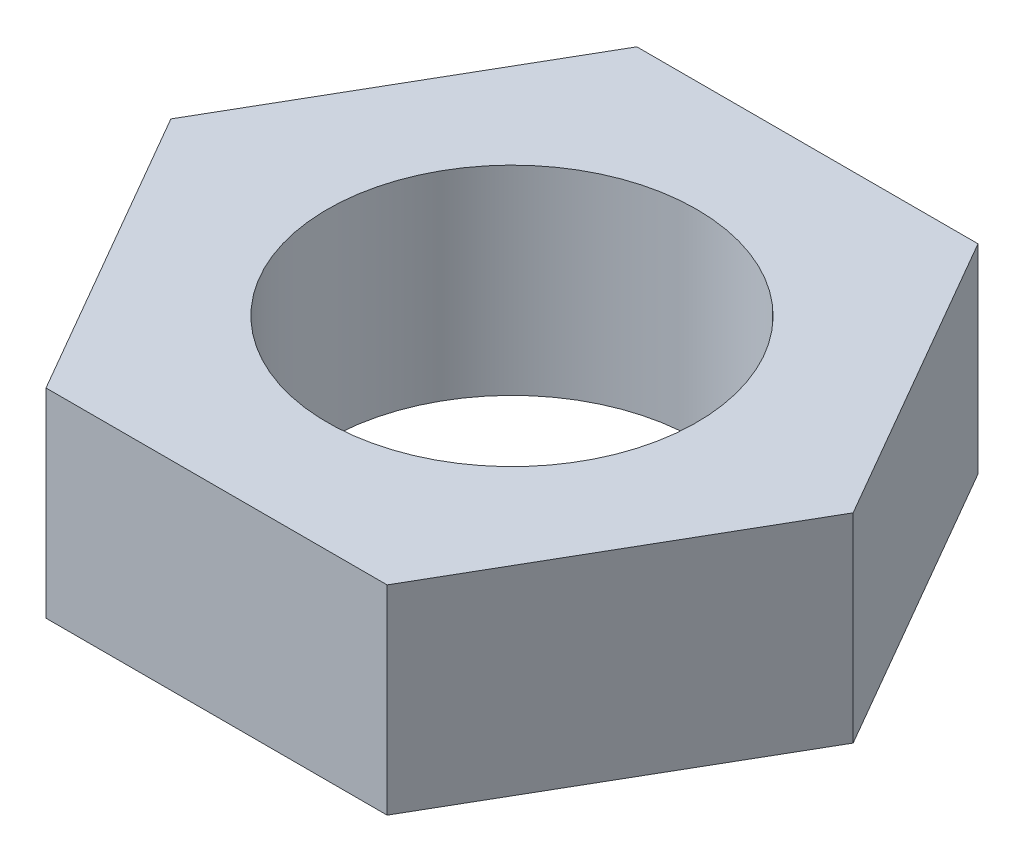
ISO-10303-21;
HEADER;
FILE_DESCRIPTION(('STEP AP214'),'2;1');
FILE_NAME('part.step','',(''),(''),'','','');
FILE_SCHEMA(('AUTOMOTIVE_DESIGN { 1 0 10303 214 1 1 1 1 }'));
ENDSEC;
DATA;
#1=APPLICATION_CONTEXT('core data for automotive mechanical design processes');
#2=APPLICATION_PROTOCOL_DEFINITION('international standard','automotive_design',2000,#1);
#3=PRODUCT_CONTEXT('',#1,'mechanical');
#4=PRODUCT('Part','Part','',(#3));
#5=PRODUCT_RELATED_PRODUCT_CATEGORY('part','',(#4));
#6=PRODUCT_DEFINITION_FORMATION('','',#4);
#7=PRODUCT_DEFINITION_CONTEXT('part definition',#1,'design');
#8=PRODUCT_DEFINITION('design','',#6,#7);
#9=PRODUCT_DEFINITION_SHAPE('','',#8);
#10=(LENGTH_UNIT() NAMED_UNIT(*) SI_UNIT(.MILLI.,.METRE.));
#11=(NAMED_UNIT(*) PLANE_ANGLE_UNIT() SI_UNIT($,.RADIAN.));
#12=(NAMED_UNIT(*) SI_UNIT($,.STERADIAN.) SOLID_ANGLE_UNIT());
#13=UNCERTAINTY_MEASURE_WITH_UNIT(LENGTH_MEASURE(1.E-05),#10,'distance_accuracy_value','');
#14=(GEOMETRIC_REPRESENTATION_CONTEXT(3) GLOBAL_UNCERTAINTY_ASSIGNED_CONTEXT((#13)) GLOBAL_UNIT_ASSIGNED_CONTEXT((#10,
#11,#12)) REPRESENTATION_CONTEXT('',''));
#15=CARTESIAN_POINT('',(0.,0.,0.));
#16=DIRECTION('',(0.,0.,1.));
#17=DIRECTION('',(1.,0.,0.));
#18=AXIS2_PLACEMENT_3D('',#15,#16,#17);
#19=CARTESIAN_POINT('',(0.,1.35,0.));
#20=DIRECTION('',(0.,1.,0.));
#21=DIRECTION('',(0.,0.,1.));
#22=AXIS2_PLACEMENT_3D('',#19,#20,#21);
#23=PLANE('',#22);
#24=DIRECTION('',(-0.5,0.,-0.866025403784439));
#25=VECTOR('',#24,1.);
#26=CARTESIAN_POINT('',(4.61880215351701,1.35,0.));
#27=LINE('',#26,#25);
#28=CARTESIAN_POINT('',(4.61880215351701,1.35,0.));
#29=VERTEX_POINT('',#28);
#30=CARTESIAN_POINT('',(2.3094010767585,1.35,-4.));
#31=VERTEX_POINT('',#30);
#32=EDGE_CURVE('E129',#29,#31,#27,.T.);
#33=ORIENTED_EDGE('',*,*,#32,.T.);
#34=DIRECTION('',(-1.,0.,0.));
#35=VECTOR('',#34,1.);
#36=CARTESIAN_POINT('',(2.3094010767585,1.35,-4.));
#37=LINE('',#36,#35);
#38=CARTESIAN_POINT('',(-2.3094010767585,1.35,-4.));
#39=VERTEX_POINT('',#38);
#40=EDGE_CURVE('E87',#31,#39,#37,.T.);
#41=ORIENTED_EDGE('',*,*,#40,.T.);
#42=DIRECTION('',(-0.499999999999999,0.,0.866025403784439));
#43=VECTOR('',#42,1.);
#44=CARTESIAN_POINT('',(-2.3094010767585,1.35,-4.));
#45=LINE('',#44,#43);
#46=CARTESIAN_POINT('',(-4.618802153517,1.35,0.));
#47=VERTEX_POINT('',#46);
#48=EDGE_CURVE('E100',#39,#47,#45,.T.);
#49=ORIENTED_EDGE('',*,*,#48,.T.);
#50=DIRECTION('',(0.5,0.,0.866025403784438));
#51=VECTOR('',#50,1.);
#52=CARTESIAN_POINT('',(-4.618802153517,1.35,0.));
#53=LINE('',#52,#51);
#54=CARTESIAN_POINT('',(-2.3094010767585,1.35,4.));
#55=VERTEX_POINT('',#54);
#56=EDGE_CURVE('E94',#47,#55,#53,.T.);
#57=ORIENTED_EDGE('',*,*,#56,.T.);
#58=DIRECTION('',(1.,0.,0.));
#59=VECTOR('',#58,1.);
#60=CARTESIAN_POINT('',(-2.3094010767585,1.35,4.));
#61=LINE('',#60,#59);
#62=CARTESIAN_POINT('',(2.3094010767585,1.35,4.));
#63=VERTEX_POINT('',#62);
#64=EDGE_CURVE('E98',#55,#63,#61,.T.);
#65=ORIENTED_EDGE('',*,*,#64,.T.);
#66=DIRECTION('',(0.5,0.,-0.866025403784439));
#67=VECTOR('',#66,1.);
#68=CARTESIAN_POINT('',(2.3094010767585,1.35,4.));
#69=LINE('',#68,#67);
#70=EDGE_CURVE('E50',#63,#29,#69,.T.);
#71=ORIENTED_EDGE('',*,*,#70,.T.);
#72=EDGE_LOOP('',(#33,#41,#49,#57,#65,#71));
#73=FACE_BOUND('',#72,.T.);
#74=CARTESIAN_POINT('',(0.,1.35,0.));
#75=DIRECTION('',(0.,1.,0.));
#76=DIRECTION('',(0.,0.,1.));
#77=AXIS2_PLACEMENT_3D('',#74,#75,#76);
#78=CIRCLE('',#77,2.5);
#79=CARTESIAN_POINT('',(0.,1.35,-2.5));
#80=VERTEX_POINT('',#79);
#81=EDGE_CURVE('E122',#80,#80,#78,.T.);
#82=ORIENTED_EDGE('',*,*,#81,.F.);
#83=EDGE_LOOP('',(#82));
#84=FACE_BOUND('',#83,.T.);
#85=ADVANCED_FACE('F33',(#73,#84),#23,.T.);
#86=CARTESIAN_POINT('',(0.,-1.35,0.));
#87=DIRECTION('',(0.,1.,0.));
#88=DIRECTION('',(0.,0.,1.));
#89=AXIS2_PLACEMENT_3D('',#86,#87,#88);
#90=PLANE('',#89);
#91=DIRECTION('',(-0.5,0.,-0.866025403784439));
#92=VECTOR('',#91,1.);
#93=CARTESIAN_POINT('',(4.61880215351701,-1.35,0.));
#94=LINE('',#93,#92);
#95=CARTESIAN_POINT('',(4.61880215351701,-1.35,0.));
#96=VERTEX_POINT('',#95);
#97=CARTESIAN_POINT('',(2.3094010767585,-1.35,-4.));
#98=VERTEX_POINT('',#97);
#99=EDGE_CURVE('E118',#96,#98,#94,.T.);
#100=ORIENTED_EDGE('',*,*,#99,.F.);
#101=DIRECTION('',(0.5,0.,-0.866025403784439));
#102=VECTOR('',#101,1.);
#103=CARTESIAN_POINT('',(2.3094010767585,-1.35,4.));
#104=LINE('',#103,#102);
#105=CARTESIAN_POINT('',(2.3094010767585,-1.35,4.));
#106=VERTEX_POINT('',#105);
#107=EDGE_CURVE('E79',#106,#96,#104,.T.);
#108=ORIENTED_EDGE('',*,*,#107,.F.);
#109=DIRECTION('',(1.,0.,0.));
#110=VECTOR('',#109,1.);
#111=CARTESIAN_POINT('',(-2.3094010767585,-1.35,4.));
#112=LINE('',#111,#110);
#113=CARTESIAN_POINT('',(-2.3094010767585,-1.35,4.));
#114=VERTEX_POINT('',#113);
#115=EDGE_CURVE('E73',#114,#106,#112,.T.);
#116=ORIENTED_EDGE('',*,*,#115,.F.);
#117=DIRECTION('',(0.5,0.,0.866025403784438));
#118=VECTOR('',#117,1.);
#119=CARTESIAN_POINT('',(-4.618802153517,-1.35,0.));
#120=LINE('',#119,#118);
#121=CARTESIAN_POINT('',(-4.618802153517,-1.35,0.));
#122=VERTEX_POINT('',#121);
#123=EDGE_CURVE('E108',#122,#114,#120,.T.);
#124=ORIENTED_EDGE('',*,*,#123,.F.);
#125=DIRECTION('',(-0.499999999999999,0.,0.866025403784439));
#126=VECTOR('',#125,1.);
#127=CARTESIAN_POINT('',(-2.3094010767585,-1.35,-4.));
#128=LINE('',#127,#126);
#129=CARTESIAN_POINT('',(-2.3094010767585,-1.35,-4.));
#130=VERTEX_POINT('',#129);
#131=EDGE_CURVE('E124',#130,#122,#128,.T.);
#132=ORIENTED_EDGE('',*,*,#131,.F.);
#133=DIRECTION('',(-1.,0.,0.));
#134=VECTOR('',#133,1.);
#135=CARTESIAN_POINT('',(2.3094010767585,-1.35,-4.));
#136=LINE('',#135,#134);
#137=EDGE_CURVE('E121',#98,#130,#136,.T.);
#138=ORIENTED_EDGE('',*,*,#137,.F.);
#139=EDGE_LOOP('',(#100,#108,#116,#124,#132,#138));
#140=FACE_BOUND('',#139,.T.);
#141=CARTESIAN_POINT('',(0.,-1.35,0.));
#142=DIRECTION('',(0.,1.,0.));
#143=DIRECTION('',(0.,0.,1.));
#144=AXIS2_PLACEMENT_3D('',#141,#142,#143);
#145=CIRCLE('',#144,2.5);
#146=CARTESIAN_POINT('',(0.,-1.35,-2.5));
#147=VERTEX_POINT('',#146);
#148=EDGE_CURVE('E222',#147,#147,#145,.T.);
#149=ORIENTED_EDGE('',*,*,#148,.T.);
#150=EDGE_LOOP('',(#149));
#151=FACE_BOUND('',#150,.T.);
#152=ADVANCED_FACE('F138',(#140,#151),#90,.F.);
#153=CARTESIAN_POINT('',(4.61880215351701,1.35,0.));
#154=DIRECTION('',(-0.866025403784438,0.,0.5));
#155=DIRECTION('',(0.5,0.,0.866025403784439));
#156=AXIS2_PLACEMENT_3D('',#153,#154,#155);
#157=PLANE('',#156);
#158=ORIENTED_EDGE('',*,*,#99,.T.);
#159=DIRECTION('',(0.,-1.,0.));
#160=VECTOR('',#159,1.);
#161=CARTESIAN_POINT('',(2.3094010767585,1.35,-4.));
#162=LINE('',#161,#160);
#163=EDGE_CURVE('E11',#31,#98,#162,.T.);
#164=ORIENTED_EDGE('',*,*,#163,.F.);
#165=ORIENTED_EDGE('',*,*,#32,.F.);
#166=DIRECTION('',(0.,-1.,0.));
#167=VECTOR('',#166,1.);
#168=CARTESIAN_POINT('',(4.61880215351701,1.35,0.));
#169=LINE('',#168,#167);
#170=EDGE_CURVE('E114',#29,#96,#169,.T.);
#171=ORIENTED_EDGE('',*,*,#170,.T.);
#172=EDGE_LOOP('',(#158,#164,#165,#171));
#173=FACE_BOUND('',#172,.T.);
#174=ADVANCED_FACE('F35',(#173),#157,.F.);
#175=CARTESIAN_POINT('',(2.3094010767585,1.35,-4.));
#176=DIRECTION('',(0.,0.,1.));
#177=DIRECTION('',(1.,0.,0.));
#178=AXIS2_PLACEMENT_3D('',#175,#176,#177);
#179=PLANE('',#178);
#180=ORIENTED_EDGE('',*,*,#137,.T.);
#181=DIRECTION('',(0.,-1.,0.));
#182=VECTOR('',#181,1.);
#183=CARTESIAN_POINT('',(-2.3094010767585,1.35,-4.));
#184=LINE('',#183,#182);
#185=EDGE_CURVE('E42',#39,#130,#184,.T.);
#186=ORIENTED_EDGE('',*,*,#185,.F.);
#187=ORIENTED_EDGE('',*,*,#40,.F.);
#188=ORIENTED_EDGE('',*,*,#163,.T.);
#189=EDGE_LOOP('',(#180,#186,#187,#188));
#190=FACE_BOUND('',#189,.T.);
#191=ADVANCED_FACE('F163',(#190),#179,.F.);
#192=CARTESIAN_POINT('',(-2.3094010767585,1.35,-4.));
#193=DIRECTION('',(0.866025403784439,0.,0.499999999999999));
#194=DIRECTION('',(0.499999999999999,0.,-0.866025403784439));
#195=AXIS2_PLACEMENT_3D('',#192,#193,#194);
#196=PLANE('',#195);
#197=ORIENTED_EDGE('',*,*,#131,.T.);
#198=DIRECTION('',(0.,-1.,0.));
#199=VECTOR('',#198,1.);
#200=CARTESIAN_POINT('',(-4.618802153517,1.35,0.));
#201=LINE('',#200,#199);
#202=EDGE_CURVE('E109',#47,#122,#201,.T.);
#203=ORIENTED_EDGE('',*,*,#202,.F.);
#204=ORIENTED_EDGE('',*,*,#48,.F.);
#205=ORIENTED_EDGE('',*,*,#185,.T.);
#206=EDGE_LOOP('',(#197,#203,#204,#205));
#207=FACE_BOUND('',#206,.T.);
#208=ADVANCED_FACE('F135',(#207),#196,.F.);
#209=CARTESIAN_POINT('',(-4.618802153517,1.35,0.));
#210=DIRECTION('',(0.866025403784438,0.,-0.5));
#211=DIRECTION('',(-0.5,0.,-0.866025403784439));
#212=AXIS2_PLACEMENT_3D('',#209,#210,#211);
#213=PLANE('',#212);
#214=ORIENTED_EDGE('',*,*,#123,.T.);
#215=DIRECTION('',(0.,-1.,0.));
#216=VECTOR('',#215,1.);
#217=CARTESIAN_POINT('',(-2.3094010767585,1.35,4.));
#218=LINE('',#217,#216);
#219=EDGE_CURVE('E105',#55,#114,#218,.T.);
#220=ORIENTED_EDGE('',*,*,#219,.F.);
#221=ORIENTED_EDGE('',*,*,#56,.F.);
#222=ORIENTED_EDGE('',*,*,#202,.T.);
#223=EDGE_LOOP('',(#214,#220,#221,#222));
#224=FACE_BOUND('',#223,.T.);
#225=ADVANCED_FACE('F106',(#224),#213,.F.);
#226=CARTESIAN_POINT('',(-2.3094010767585,1.35,4.));
#227=DIRECTION('',(0.,0.,-1.));
#228=DIRECTION('',(-1.,0.,0.));
#229=AXIS2_PLACEMENT_3D('',#226,#227,#228);
#230=PLANE('',#229);
#231=ORIENTED_EDGE('',*,*,#115,.T.);
#232=DIRECTION('',(0.,-1.,0.));
#233=VECTOR('',#232,1.);
#234=CARTESIAN_POINT('',(2.3094010767585,1.35,4.));
#235=LINE('',#234,#233);
#236=EDGE_CURVE('E110',#63,#106,#235,.T.);
#237=ORIENTED_EDGE('',*,*,#236,.F.);
#238=ORIENTED_EDGE('',*,*,#64,.F.);
#239=ORIENTED_EDGE('',*,*,#219,.T.);
#240=EDGE_LOOP('',(#231,#237,#238,#239));
#241=FACE_BOUND('',#240,.T.);
#242=ADVANCED_FACE('F112',(#241),#230,.F.);
#243=CARTESIAN_POINT('',(2.3094010767585,1.35,4.));
#244=DIRECTION('',(-0.866025403784439,0.,-0.5));
#245=DIRECTION('',(-0.5,0.,0.866025403784439));
#246=AXIS2_PLACEMENT_3D('',#243,#244,#245);
#247=PLANE('',#246);
#248=ORIENTED_EDGE('',*,*,#107,.T.);
#249=ORIENTED_EDGE('',*,*,#170,.F.);
#250=ORIENTED_EDGE('',*,*,#70,.F.);
#251=ORIENTED_EDGE('',*,*,#236,.T.);
#252=EDGE_LOOP('',(#248,#249,#250,#251));
#253=FACE_BOUND('',#252,.T.);
#254=ADVANCED_FACE('F143',(#253),#247,.F.);
#255=CARTESIAN_POINT('',(0.,1.35,0.));
#256=DIRECTION('',(0.,-1.,0.));
#257=DIRECTION('',(0.,0.,-1.));
#258=AXIS2_PLACEMENT_3D('',#255,#256,#257);
#259=CYLINDRICAL_SURFACE('',#258,2.5);
#260=CARTESIAN_POINT('',(0.,1.35,-2.5));
#261=CARTESIAN_POINT('',(0.,1.321875,-2.5));
#262=CARTESIAN_POINT('',(0.,1.29375,-2.5));
#263=CARTESIAN_POINT('',(0.,1.2375,-2.5));
#264=CARTESIAN_POINT('',(0.,1.209375,-2.5));
#265=CARTESIAN_POINT('',(0.,1.153125,-2.5));
#266=CARTESIAN_POINT('',(0.,1.125,-2.5));
#267=CARTESIAN_POINT('',(0.,1.06875,-2.5));
#268=CARTESIAN_POINT('',(0.,1.040625,-2.5));
#269=CARTESIAN_POINT('',(0.,0.984375,-2.5));
#270=CARTESIAN_POINT('',(0.,0.95625,-2.5));
#271=CARTESIAN_POINT('',(0.,0.9,-2.5));
#272=CARTESIAN_POINT('',(0.,0.871875,-2.5));
#273=CARTESIAN_POINT('',(0.,0.815625,-2.5));
#274=CARTESIAN_POINT('',(0.,0.7875,-2.5));
#275=CARTESIAN_POINT('',(0.,0.73125,-2.5));
#276=CARTESIAN_POINT('',(0.,0.703125,-2.5));
#277=CARTESIAN_POINT('',(0.,0.646875,-2.5));
#278=CARTESIAN_POINT('',(0.,0.61875,-2.5));
#279=CARTESIAN_POINT('',(0.,0.5625,-2.5));
#280=CARTESIAN_POINT('',(0.,0.534375,-2.5));
#281=CARTESIAN_POINT('',(0.,0.478125,-2.5));
#282=CARTESIAN_POINT('',(0.,0.45,-2.5));
#283=CARTESIAN_POINT('',(0.,0.39375,-2.5));
#284=CARTESIAN_POINT('',(0.,0.365625,-2.5));
#285=CARTESIAN_POINT('',(0.,0.309375,-2.5));
#286=CARTESIAN_POINT('',(0.,0.28125,-2.5));
#287=CARTESIAN_POINT('',(0.,0.225,-2.5));
#288=CARTESIAN_POINT('',(0.,0.196875,-2.5));
#289=CARTESIAN_POINT('',(0.,0.140625,-2.5));
#290=CARTESIAN_POINT('',(0.,0.1125,-2.5));
#291=CARTESIAN_POINT('',(0.,0.0562499999999996,-2.5));
#292=CARTESIAN_POINT('',(0.,0.0281249999999996,-2.5));
#293=CARTESIAN_POINT('',(0.,-0.0281250000000004,-2.5));
#294=CARTESIAN_POINT('',(0.,-0.0562500000000005,-2.5));
#295=CARTESIAN_POINT('',(0.,-0.1125,-2.5));
#296=CARTESIAN_POINT('',(0.,-0.140625,-2.5));
#297=CARTESIAN_POINT('',(0.,-0.196875000000001,-2.5));
#298=CARTESIAN_POINT('',(0.,-0.225000000000001,-2.5));
#299=CARTESIAN_POINT('',(0.,-0.28125,-2.5));
#300=CARTESIAN_POINT('',(0.,-0.309375000000001,-2.5));
#301=CARTESIAN_POINT('',(0.,-0.365625000000001,-2.5));
#302=CARTESIAN_POINT('',(0.,-0.393750000000001,-2.5));
#303=CARTESIAN_POINT('',(0.,-0.450000000000001,-2.5));
#304=CARTESIAN_POINT('',(0.,-0.478125000000001,-2.5));
#305=CARTESIAN_POINT('',(0.,-0.534375000000001,-2.5));
#306=CARTESIAN_POINT('',(0.,-0.562500000000001,-2.5));
#307=CARTESIAN_POINT('',(0.,-0.61875,-2.5));
#308=CARTESIAN_POINT('',(0.,-0.646875,-2.5));
#309=CARTESIAN_POINT('',(0.,-0.703125,-2.5));
#310=CARTESIAN_POINT('',(0.,-0.73125,-2.5));
#311=CARTESIAN_POINT('',(0.,-0.7875,-2.5));
#312=CARTESIAN_POINT('',(0.,-0.815625,-2.5));
#313=CARTESIAN_POINT('',(0.,-0.871875,-2.5));
#314=CARTESIAN_POINT('',(0.,-0.9,-2.5));
#315=CARTESIAN_POINT('',(0.,-0.95625,-2.5));
#316=CARTESIAN_POINT('',(0.,-0.984375,-2.5));
#317=CARTESIAN_POINT('',(0.,-1.040625,-2.5));
#318=CARTESIAN_POINT('',(0.,-1.06875,-2.5));
#319=CARTESIAN_POINT('',(0.,-1.125,-2.5));
#320=CARTESIAN_POINT('',(0.,-1.153125,-2.5));
#321=CARTESIAN_POINT('',(0.,-1.209375,-2.5));
#322=CARTESIAN_POINT('',(0.,-1.2375,-2.5));
#323=CARTESIAN_POINT('',(0.,-1.29375,-2.5));
#324=CARTESIAN_POINT('',(0.,-1.321875,-2.5));
#325=CARTESIAN_POINT('',(0.,-1.35,-2.5));
#326=B_SPLINE_CURVE_WITH_KNOTS('',3,(#260,#261,#262,#263,#264,#265,#266,#267,#268,#269,#270,
#271,#272,#273,#274,#275,#276,#277,#278,#279,#280,#281,#282,#283,#284,#285,#286,#287,#288,#289,
#290,#291,#292,#293,#294,#295,#296,#297,#298,#299,#300,#301,#302,#303,#304,#305,#306,#307,#308,
#309,#310,#311,#312,#313,#314,#315,#316,#317,#318,#319,#320,#321,#322,#323,#324,#325),
.UNSPECIFIED.,.F.,.F.,(4,2,2,2,2,2,2,2,2,2,2,2,2,2,2,2,2,2,2,2,2,2,2,2,2,2,2,2,2,2,2,2,4),(0.,
0.0843749999999998,0.16875,0.253125,0.3375,0.421875,0.50625,0.590625,0.675,0.759375,0.84375,
0.928125,1.0125,1.096875,1.18125,1.265625,1.35,1.434375,1.51875,1.603125,1.6875,1.771875,
1.85625,1.940625,2.025,2.109375,2.19375,2.278125,2.3625,2.446875,2.53125,2.615625,2.7),.UNSPECIFIED.);
#327=EDGE_CURVE('BSEAM145',#80,#147,#326,.T.);
#328=ORIENTED_EDGE('',*,*,#81,.T.);
#329=ORIENTED_EDGE('',*,*,#148,.F.);
#330=ORIENTED_EDGE('',*,*,#327,.T.);
#331=ORIENTED_EDGE('',*,*,#327,.F.);
#332=EDGE_LOOP('',(#328,#330,#329,#331));
#333=FACE_BOUND('',#332,.T.);
#334=ADVANCED_FACE('F145',(#333),#259,.F.);
#335=CLOSED_SHELL('',(#85,#152,#174,#191,#208,#225,#242,#254,#334));
#336=MANIFOLD_SOLID_BREP('B2',#335);
#337=ADVANCED_BREP_SHAPE_REPRESENTATION('',(#18,#336),#14);
#338=SHAPE_DEFINITION_REPRESENTATION(#9,#337);
ENDSEC;
END-ISO-10303-21;
